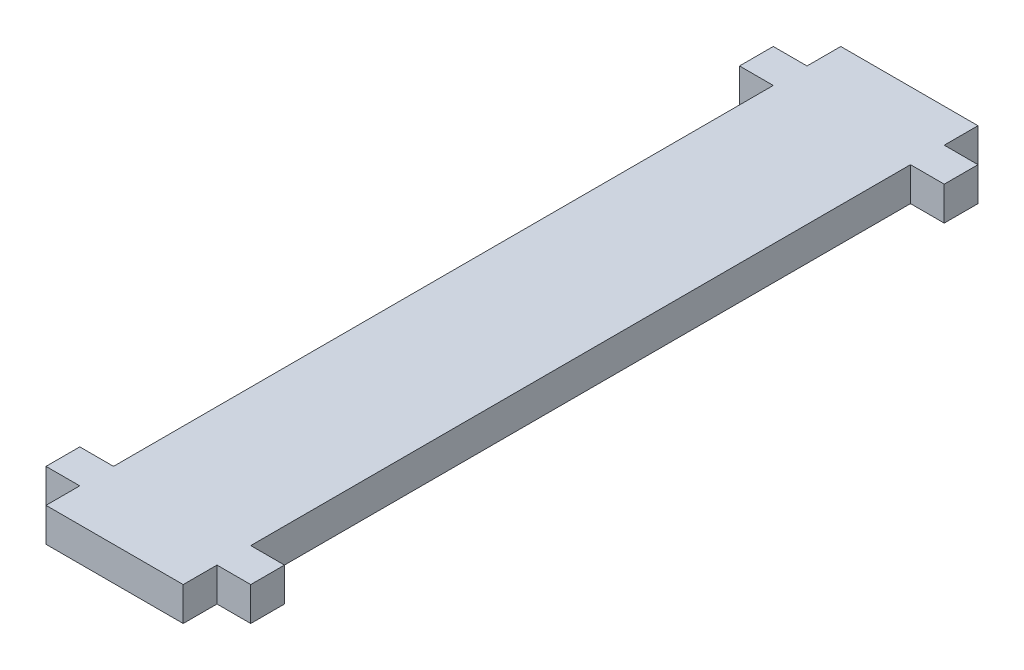
ISO-10303-21;
HEADER;
FILE_DESCRIPTION(('STEP AP214'),'2;1');
FILE_NAME('part.step','',(''),(''),'','','');
FILE_SCHEMA(('AUTOMOTIVE_DESIGN { 1 0 10303 214 1 1 1 1 }'));
ENDSEC;
DATA;
#1=APPLICATION_CONTEXT('core data for automotive mechanical design processes');
#2=APPLICATION_PROTOCOL_DEFINITION('international standard','automotive_design',2000,#1);
#3=PRODUCT_CONTEXT('',#1,'mechanical');
#4=PRODUCT('Part','Part','',(#3));
#5=PRODUCT_RELATED_PRODUCT_CATEGORY('part','',(#4));
#6=PRODUCT_DEFINITION_FORMATION('','',#4);
#7=PRODUCT_DEFINITION_CONTEXT('part definition',#1,'design');
#8=PRODUCT_DEFINITION('design','',#6,#7);
#9=PRODUCT_DEFINITION_SHAPE('','',#8);
#10=(LENGTH_UNIT() NAMED_UNIT(*) SI_UNIT(.MILLI.,.METRE.));
#11=(NAMED_UNIT(*) PLANE_ANGLE_UNIT() SI_UNIT($,.RADIAN.));
#12=(NAMED_UNIT(*) SI_UNIT($,.STERADIAN.) SOLID_ANGLE_UNIT());
#13=UNCERTAINTY_MEASURE_WITH_UNIT(LENGTH_MEASURE(1.E-05),#10,'distance_accuracy_value','');
#14=(GEOMETRIC_REPRESENTATION_CONTEXT(3) GLOBAL_UNCERTAINTY_ASSIGNED_CONTEXT((#13)) GLOBAL_UNIT_ASSIGNED_CONTEXT((#10,
#11,#12)) REPRESENTATION_CONTEXT('',''));
#15=CARTESIAN_POINT('',(0.,0.,0.));
#16=DIRECTION('',(0.,0.,1.));
#17=DIRECTION('',(1.,0.,0.));
#18=AXIS2_PLACEMENT_3D('',#15,#16,#17);
#19=CARTESIAN_POINT('',(-60.2742,3.1242,-128.8542));
#20=DIRECTION('',(1.,0.,0.));
#21=DIRECTION('',(0.,0.,-1.));
#22=AXIS2_PLACEMENT_3D('',#19,#20,#21);
#23=PLANE('',#22);
#24=DIRECTION('',(0.,0.,1.));
#25=VECTOR('',#24,1.);
#26=CARTESIAN_POINT('',(-60.2742,0.,-128.8542));
#27=LINE('',#26,#25);
#28=CARTESIAN_POINT('',(-60.2742,0.,-128.8542));
#29=VERTEX_POINT('',#28);
#30=CARTESIAN_POINT('',(-60.2742,0.,-125.73));
#31=VERTEX_POINT('',#30);
#32=EDGE_CURVE('E201',#29,#31,#27,.T.);
#33=ORIENTED_EDGE('',*,*,#32,.T.);
#34=DIRECTION('',(0.,-1.,0.));
#35=VECTOR('',#34,1.);
#36=CARTESIAN_POINT('',(-60.2742,3.1242,-125.73));
#37=LINE('',#36,#35);
#38=CARTESIAN_POINT('',(-60.2742,3.1242,-125.73));
#39=VERTEX_POINT('',#38);
#40=EDGE_CURVE('E11',#39,#31,#37,.T.);
#41=ORIENTED_EDGE('',*,*,#40,.F.);
#42=DIRECTION('',(0.,0.,1.));
#43=VECTOR('',#42,1.);
#44=CARTESIAN_POINT('',(-60.2742,3.1242,-128.8542));
#45=LINE('',#44,#43);
#46=CARTESIAN_POINT('',(-60.2742,3.1242,-128.8542));
#47=VERTEX_POINT('',#46);
#48=EDGE_CURVE('E239',#47,#39,#45,.T.);
#49=ORIENTED_EDGE('',*,*,#48,.F.);
#50=DIRECTION('',(0.,-1.,0.));
#51=VECTOR('',#50,1.);
#52=CARTESIAN_POINT('',(-60.2742,3.1242,-128.8542));
#53=LINE('',#52,#51);
#54=EDGE_CURVE('E197',#47,#29,#53,.T.);
#55=ORIENTED_EDGE('',*,*,#54,.T.);
#56=EDGE_LOOP('',(#33,#41,#49,#55));
#57=FACE_BOUND('',#56,.T.);
#58=ADVANCED_FACE('F33',(#57),#23,.F.);
#59=CARTESIAN_POINT('',(-60.2742,3.1242,-125.73));
#60=DIRECTION('',(0.,0.,-1.));
#61=DIRECTION('',(-1.,0.,0.));
#62=AXIS2_PLACEMENT_3D('',#59,#60,#61);
#63=PLANE('',#62);
#64=DIRECTION('',(1.,0.,0.));
#65=VECTOR('',#64,1.);
#66=CARTESIAN_POINT('',(-60.2742,0.,-125.73));
#67=LINE('',#66,#65);
#68=CARTESIAN_POINT('',(-57.15,0.,-125.73));
#69=VERTEX_POINT('',#68);
#70=EDGE_CURVE('E204',#31,#69,#67,.T.);
#71=ORIENTED_EDGE('',*,*,#70,.T.);
#72=DIRECTION('',(0.,-1.,0.));
#73=VECTOR('',#72,1.);
#74=CARTESIAN_POINT('',(-57.15,3.1242,-125.73));
#75=LINE('',#74,#73);
#76=CARTESIAN_POINT('',(-57.15,3.1242,-125.73));
#77=VERTEX_POINT('',#76);
#78=EDGE_CURVE('E41',#77,#69,#75,.T.);
#79=ORIENTED_EDGE('',*,*,#78,.F.);
#80=DIRECTION('',(1.,0.,0.));
#81=VECTOR('',#80,1.);
#82=CARTESIAN_POINT('',(-60.2742,3.1242,-125.73));
#83=LINE('',#82,#81);
#84=EDGE_CURVE('E128',#39,#77,#83,.T.);
#85=ORIENTED_EDGE('',*,*,#84,.F.);
#86=ORIENTED_EDGE('',*,*,#40,.T.);
#87=EDGE_LOOP('',(#71,#79,#85,#86));
#88=FACE_BOUND('',#87,.T.);
#89=ADVANCED_FACE('F357',(#88),#63,.F.);
#90=CARTESIAN_POINT('',(-57.15,3.1242,-125.73));
#91=DIRECTION('',(1.,0.,0.));
#92=DIRECTION('',(0.,0.,-1.));
#93=AXIS2_PLACEMENT_3D('',#90,#91,#92);
#94=PLANE('',#93);
#95=DIRECTION('',(0.,0.,1.));
#96=VECTOR('',#95,1.);
#97=CARTESIAN_POINT('',(-57.15,0.,-125.73));
#98=LINE('',#97,#96);
#99=CARTESIAN_POINT('',(-57.15,0.,-64.6684));
#100=VERTEX_POINT('',#99);
#101=EDGE_CURVE('E206',#69,#100,#98,.T.);
#102=ORIENTED_EDGE('',*,*,#101,.T.);
#103=DIRECTION('',(0.,-1.,0.));
#104=VECTOR('',#103,1.);
#105=CARTESIAN_POINT('',(-57.15,3.1242,-64.6684));
#106=LINE('',#105,#104);
#107=CARTESIAN_POINT('',(-57.15,3.1242,-64.6684));
#108=VERTEX_POINT('',#107);
#109=EDGE_CURVE('E282',#108,#100,#106,.T.);
#110=ORIENTED_EDGE('',*,*,#109,.F.);
#111=DIRECTION('',(0.,0.,1.));
#112=VECTOR('',#111,1.);
#113=CARTESIAN_POINT('',(-57.15,3.1242,-125.73));
#114=LINE('',#113,#112);
#115=EDGE_CURVE('E290',#77,#108,#114,.T.);
#116=ORIENTED_EDGE('',*,*,#115,.F.);
#117=ORIENTED_EDGE('',*,*,#78,.T.);
#118=EDGE_LOOP('',(#102,#110,#116,#117));
#119=FACE_BOUND('',#118,.T.);
#120=ADVANCED_FACE('F288',(#119),#94,.F.);
#121=CARTESIAN_POINT('',(-57.15,3.1242,-64.6684));
#122=DIRECTION('',(0.,0.,1.));
#123=DIRECTION('',(1.,0.,0.));
#124=AXIS2_PLACEMENT_3D('',#121,#122,#123);
#125=PLANE('',#124);
#126=DIRECTION('',(-1.,0.,0.));
#127=VECTOR('',#126,1.);
#128=CARTESIAN_POINT('',(-57.15,0.,-64.6684));
#129=LINE('',#128,#127);
#130=CARTESIAN_POINT('',(-60.2742,0.,-64.6684));
#131=VERTEX_POINT('',#130);
#132=EDGE_CURVE('E208',#100,#131,#129,.T.);
#133=ORIENTED_EDGE('',*,*,#132,.T.);
#134=DIRECTION('',(0.,-1.,0.));
#135=VECTOR('',#134,1.);
#136=CARTESIAN_POINT('',(-60.2742,3.1242,-64.6684));
#137=LINE('',#136,#135);
#138=CARTESIAN_POINT('',(-60.2742,3.1242,-64.6684));
#139=VERTEX_POINT('',#138);
#140=EDGE_CURVE('E279',#139,#131,#137,.T.);
#141=ORIENTED_EDGE('',*,*,#140,.F.);
#142=DIRECTION('',(-1.,0.,0.));
#143=VECTOR('',#142,1.);
#144=CARTESIAN_POINT('',(-57.15,3.1242,-64.6684));
#145=LINE('',#144,#143);
#146=EDGE_CURVE('E308',#108,#139,#145,.T.);
#147=ORIENTED_EDGE('',*,*,#146,.F.);
#148=ORIENTED_EDGE('',*,*,#109,.T.);
#149=EDGE_LOOP('',(#133,#141,#147,#148));
#150=FACE_BOUND('',#149,.T.);
#151=ADVANCED_FACE('F299',(#150),#125,.F.);
#152=CARTESIAN_POINT('',(-60.2742,3.1242,-64.6684));
#153=DIRECTION('',(1.,0.,0.));
#154=DIRECTION('',(0.,0.,-1.));
#155=AXIS2_PLACEMENT_3D('',#152,#153,#154);
#156=PLANE('',#155);
#157=DIRECTION('',(0.,0.,1.));
#158=VECTOR('',#157,1.);
#159=CARTESIAN_POINT('',(-60.2742,0.,-64.6684));
#160=LINE('',#159,#158);
#161=CARTESIAN_POINT('',(-60.2742,0.,-61.5442));
#162=VERTEX_POINT('',#161);
#163=EDGE_CURVE('E210',#131,#162,#160,.T.);
#164=ORIENTED_EDGE('',*,*,#163,.T.);
#165=DIRECTION('',(0.,-1.,0.));
#166=VECTOR('',#165,1.);
#167=CARTESIAN_POINT('',(-60.2742,3.1242,-61.5442));
#168=LINE('',#167,#166);
#169=CARTESIAN_POINT('',(-60.2742,3.1242,-61.5442));
#170=VERTEX_POINT('',#169);
#171=EDGE_CURVE('E276',#170,#162,#168,.T.);
#172=ORIENTED_EDGE('',*,*,#171,.F.);
#173=DIRECTION('',(0.,0.,1.));
#174=VECTOR('',#173,1.);
#175=CARTESIAN_POINT('',(-60.2742,3.1242,-64.6684));
#176=LINE('',#175,#174);
#177=EDGE_CURVE('E305',#139,#170,#176,.T.);
#178=ORIENTED_EDGE('',*,*,#177,.F.);
#179=ORIENTED_EDGE('',*,*,#140,.T.);
#180=EDGE_LOOP('',(#164,#172,#178,#179));
#181=FACE_BOUND('',#180,.T.);
#182=ADVANCED_FACE('F303',(#181),#156,.F.);
#183=CARTESIAN_POINT('',(-60.2742,3.1242,-61.5442));
#184=DIRECTION('',(0.,0.,-1.));
#185=DIRECTION('',(-1.,0.,0.));
#186=AXIS2_PLACEMENT_3D('',#183,#184,#185);
#187=PLANE('',#186);
#188=DIRECTION('',(1.,0.,0.));
#189=VECTOR('',#188,1.);
#190=CARTESIAN_POINT('',(-60.2742,0.,-61.5442));
#191=LINE('',#190,#189);
#192=CARTESIAN_POINT('',(-57.15,0.,-61.5442));
#193=VERTEX_POINT('',#192);
#194=EDGE_CURVE('E212',#162,#193,#191,.T.);
#195=ORIENTED_EDGE('',*,*,#194,.T.);
#196=DIRECTION('',(0.,-1.,0.));
#197=VECTOR('',#196,1.);
#198=CARTESIAN_POINT('',(-57.15,3.1242,-61.5442));
#199=LINE('',#198,#197);
#200=CARTESIAN_POINT('',(-57.15,3.1242,-61.5442));
#201=VERTEX_POINT('',#200);
#202=EDGE_CURVE('E273',#201,#193,#199,.T.);
#203=ORIENTED_EDGE('',*,*,#202,.F.);
#204=DIRECTION('',(1.,0.,0.));
#205=VECTOR('',#204,1.);
#206=CARTESIAN_POINT('',(-60.2742,3.1242,-61.5442));
#207=LINE('',#206,#205);
#208=EDGE_CURVE('E307',#170,#201,#207,.T.);
#209=ORIENTED_EDGE('',*,*,#208,.F.);
#210=ORIENTED_EDGE('',*,*,#171,.T.);
#211=EDGE_LOOP('',(#195,#203,#209,#210));
#212=FACE_BOUND('',#211,.T.);
#213=ADVANCED_FACE('F370',(#212),#187,.F.);
#214=CARTESIAN_POINT('',(-57.15,3.1242,-61.5442));
#215=DIRECTION('',(1.,0.,0.));
#216=DIRECTION('',(0.,0.,-1.));
#217=AXIS2_PLACEMENT_3D('',#214,#215,#216);
#218=PLANE('',#217);
#219=DIRECTION('',(0.,0.,1.));
#220=VECTOR('',#219,1.);
#221=CARTESIAN_POINT('',(-57.15,0.,-61.5442));
#222=LINE('',#221,#220);
#223=CARTESIAN_POINT('',(-57.15,0.,-58.42));
#224=VERTEX_POINT('',#223);
#225=EDGE_CURVE('E214',#193,#224,#222,.T.);
#226=ORIENTED_EDGE('',*,*,#225,.T.);
#227=DIRECTION('',(0.,-1.,0.));
#228=VECTOR('',#227,1.);
#229=CARTESIAN_POINT('',(-57.15,3.1242,-58.42));
#230=LINE('',#229,#228);
#231=CARTESIAN_POINT('',(-57.15,3.1242,-58.42));
#232=VERTEX_POINT('',#231);
#233=EDGE_CURVE('E270',#232,#224,#230,.T.);
#234=ORIENTED_EDGE('',*,*,#233,.F.);
#235=DIRECTION('',(0.,0.,1.));
#236=VECTOR('',#235,1.);
#237=CARTESIAN_POINT('',(-57.15,3.1242,-61.5442));
#238=LINE('',#237,#236);
#239=EDGE_CURVE('E310',#201,#232,#238,.T.);
#240=ORIENTED_EDGE('',*,*,#239,.F.);
#241=ORIENTED_EDGE('',*,*,#202,.T.);
#242=EDGE_LOOP('',(#226,#234,#240,#241));
#243=FACE_BOUND('',#242,.T.);
#244=ADVANCED_FACE('F373',(#243),#218,.F.);
#245=CARTESIAN_POINT('',(-57.15,3.1242,-58.42));
#246=DIRECTION('',(0.,0.,-1.));
#247=DIRECTION('',(-1.,0.,0.));
#248=AXIS2_PLACEMENT_3D('',#245,#246,#247);
#249=PLANE('',#248);
#250=DIRECTION('',(1.,0.,0.));
#251=VECTOR('',#250,1.);
#252=CARTESIAN_POINT('',(-57.15,0.,-58.42));
#253=LINE('',#252,#251);
#254=CARTESIAN_POINT('',(-44.45,0.,-58.42));
#255=VERTEX_POINT('',#254);
#256=EDGE_CURVE('E216',#224,#255,#253,.T.);
#257=ORIENTED_EDGE('',*,*,#256,.T.);
#258=DIRECTION('',(0.,-1.,0.));
#259=VECTOR('',#258,1.);
#260=CARTESIAN_POINT('',(-44.45,3.1242,-58.42));
#261=LINE('',#260,#259);
#262=CARTESIAN_POINT('',(-44.45,3.1242,-58.42));
#263=VERTEX_POINT('',#262);
#264=EDGE_CURVE('E267',#263,#255,#261,.T.);
#265=ORIENTED_EDGE('',*,*,#264,.F.);
#266=DIRECTION('',(1.,0.,0.));
#267=VECTOR('',#266,1.);
#268=CARTESIAN_POINT('',(-57.15,3.1242,-58.42));
#269=LINE('',#268,#267);
#270=EDGE_CURVE('E316',#232,#263,#269,.T.);
#271=ORIENTED_EDGE('',*,*,#270,.F.);
#272=ORIENTED_EDGE('',*,*,#233,.T.);
#273=EDGE_LOOP('',(#257,#265,#271,#272));
#274=FACE_BOUND('',#273,.T.);
#275=ADVANCED_FACE('F377',(#274),#249,.F.);
#276=CARTESIAN_POINT('',(-44.45,3.1242,-58.42));
#277=DIRECTION('',(-1.,0.,0.));
#278=DIRECTION('',(0.,0.,1.));
#279=AXIS2_PLACEMENT_3D('',#276,#277,#278);
#280=PLANE('',#279);
#281=DIRECTION('',(0.,0.,-1.));
#282=VECTOR('',#281,1.);
#283=CARTESIAN_POINT('',(-44.45,0.,-58.42));
#284=LINE('',#283,#282);
#285=CARTESIAN_POINT('',(-44.45,0.,-61.5442));
#286=VERTEX_POINT('',#285);
#287=EDGE_CURVE('E218',#255,#286,#284,.T.);
#288=ORIENTED_EDGE('',*,*,#287,.T.);
#289=DIRECTION('',(0.,-1.,0.));
#290=VECTOR('',#289,1.);
#291=CARTESIAN_POINT('',(-44.45,3.1242,-61.5442));
#292=LINE('',#291,#290);
#293=CARTESIAN_POINT('',(-44.45,3.1242,-61.5442));
#294=VERTEX_POINT('',#293);
#295=EDGE_CURVE('E264',#294,#286,#292,.T.);
#296=ORIENTED_EDGE('',*,*,#295,.F.);
#297=DIRECTION('',(0.,0.,-1.));
#298=VECTOR('',#297,1.);
#299=CARTESIAN_POINT('',(-44.45,3.1242,-58.42));
#300=LINE('',#299,#298);
#301=EDGE_CURVE('E318',#263,#294,#300,.T.);
#302=ORIENTED_EDGE('',*,*,#301,.F.);
#303=ORIENTED_EDGE('',*,*,#264,.T.);
#304=EDGE_LOOP('',(#288,#296,#302,#303));
#305=FACE_BOUND('',#304,.T.);
#306=ADVANCED_FACE('F381',(#305),#280,.F.);
#307=CARTESIAN_POINT('',(-44.45,3.1242,-61.5442));
#308=DIRECTION('',(0.,0.,-1.));
#309=DIRECTION('',(-1.,0.,0.));
#310=AXIS2_PLACEMENT_3D('',#307,#308,#309);
#311=PLANE('',#310);
#312=DIRECTION('',(1.,0.,0.));
#313=VECTOR('',#312,1.);
#314=CARTESIAN_POINT('',(-44.45,0.,-61.5442));
#315=LINE('',#314,#313);
#316=CARTESIAN_POINT('',(-41.3258,0.,-61.5442));
#317=VERTEX_POINT('',#316);
#318=EDGE_CURVE('E220',#286,#317,#315,.T.);
#319=ORIENTED_EDGE('',*,*,#318,.T.);
#320=DIRECTION('',(0.,-1.,0.));
#321=VECTOR('',#320,1.);
#322=CARTESIAN_POINT('',(-41.3258,3.1242,-61.5442));
#323=LINE('',#322,#321);
#324=CARTESIAN_POINT('',(-41.3258,3.1242,-61.5442));
#325=VERTEX_POINT('',#324);
#326=EDGE_CURVE('E261',#325,#317,#323,.T.);
#327=ORIENTED_EDGE('',*,*,#326,.F.);
#328=DIRECTION('',(1.,0.,0.));
#329=VECTOR('',#328,1.);
#330=CARTESIAN_POINT('',(-44.45,3.1242,-61.5442));
#331=LINE('',#330,#329);
#332=EDGE_CURVE('E320',#294,#325,#331,.T.);
#333=ORIENTED_EDGE('',*,*,#332,.F.);
#334=ORIENTED_EDGE('',*,*,#295,.T.);
#335=EDGE_LOOP('',(#319,#327,#333,#334));
#336=FACE_BOUND('',#335,.T.);
#337=ADVANCED_FACE('F385',(#336),#311,.F.);
#338=CARTESIAN_POINT('',(-41.3258,3.1242,-61.5442));
#339=DIRECTION('',(-1.,0.,0.));
#340=DIRECTION('',(0.,0.,1.));
#341=AXIS2_PLACEMENT_3D('',#338,#339,#340);
#342=PLANE('',#341);
#343=DIRECTION('',(0.,0.,-1.));
#344=VECTOR('',#343,1.);
#345=CARTESIAN_POINT('',(-41.3258,0.,-61.5442));
#346=LINE('',#345,#344);
#347=CARTESIAN_POINT('',(-41.3258,0.,-64.6684));
#348=VERTEX_POINT('',#347);
#349=EDGE_CURVE('E222',#317,#348,#346,.T.);
#350=ORIENTED_EDGE('',*,*,#349,.T.);
#351=DIRECTION('',(0.,-1.,0.));
#352=VECTOR('',#351,1.);
#353=CARTESIAN_POINT('',(-41.3258,3.1242,-64.6684));
#354=LINE('',#353,#352);
#355=CARTESIAN_POINT('',(-41.3258,3.1242,-64.6684));
#356=VERTEX_POINT('',#355);
#357=EDGE_CURVE('E258',#356,#348,#354,.T.);
#358=ORIENTED_EDGE('',*,*,#357,.F.);
#359=DIRECTION('',(0.,0.,-1.));
#360=VECTOR('',#359,1.);
#361=CARTESIAN_POINT('',(-41.3258,3.1242,-61.5442));
#362=LINE('',#361,#360);
#363=EDGE_CURVE('E322',#325,#356,#362,.T.);
#364=ORIENTED_EDGE('',*,*,#363,.F.);
#365=ORIENTED_EDGE('',*,*,#326,.T.);
#366=EDGE_LOOP('',(#350,#358,#364,#365));
#367=FACE_BOUND('',#366,.T.);
#368=ADVANCED_FACE('F389',(#367),#342,.F.);
#369=CARTESIAN_POINT('',(-41.3258,3.1242,-64.6684));
#370=DIRECTION('',(0.,0.,1.));
#371=DIRECTION('',(1.,0.,0.));
#372=AXIS2_PLACEMENT_3D('',#369,#370,#371);
#373=PLANE('',#372);
#374=DIRECTION('',(-1.,0.,0.));
#375=VECTOR('',#374,1.);
#376=CARTESIAN_POINT('',(-41.3258,0.,-64.6684));
#377=LINE('',#376,#375);
#378=CARTESIAN_POINT('',(-44.45,0.,-64.6684));
#379=VERTEX_POINT('',#378);
#380=EDGE_CURVE('E224',#348,#379,#377,.T.);
#381=ORIENTED_EDGE('',*,*,#380,.T.);
#382=DIRECTION('',(0.,-1.,0.));
#383=VECTOR('',#382,1.);
#384=CARTESIAN_POINT('',(-44.45,3.1242,-64.6684));
#385=LINE('',#384,#383);
#386=CARTESIAN_POINT('',(-44.45,3.1242,-64.6684));
#387=VERTEX_POINT('',#386);
#388=EDGE_CURVE('E255',#387,#379,#385,.T.);
#389=ORIENTED_EDGE('',*,*,#388,.F.);
#390=DIRECTION('',(-1.,0.,0.));
#391=VECTOR('',#390,1.);
#392=CARTESIAN_POINT('',(-41.3258,3.1242,-64.6684));
#393=LINE('',#392,#391);
#394=EDGE_CURVE('E324',#356,#387,#393,.T.);
#395=ORIENTED_EDGE('',*,*,#394,.F.);
#396=ORIENTED_EDGE('',*,*,#357,.T.);
#397=EDGE_LOOP('',(#381,#389,#395,#396));
#398=FACE_BOUND('',#397,.T.);
#399=ADVANCED_FACE('F393',(#398),#373,.F.);
#400=CARTESIAN_POINT('',(-44.45,3.1242,-64.6684));
#401=DIRECTION('',(-1.,0.,0.));
#402=DIRECTION('',(0.,0.,1.));
#403=AXIS2_PLACEMENT_3D('',#400,#401,#402);
#404=PLANE('',#403);
#405=DIRECTION('',(0.,0.,-1.));
#406=VECTOR('',#405,1.);
#407=CARTESIAN_POINT('',(-44.45,0.,-64.6684));
#408=LINE('',#407,#406);
#409=CARTESIAN_POINT('',(-44.4500000000001,0.,-125.73));
#410=VERTEX_POINT('',#409);
#411=EDGE_CURVE('E226',#379,#410,#408,.T.);
#412=ORIENTED_EDGE('',*,*,#411,.T.);
#413=DIRECTION('',(0.,-1.,0.));
#414=VECTOR('',#413,1.);
#415=CARTESIAN_POINT('',(-44.4500000000001,3.1242,-125.73));
#416=LINE('',#415,#414);
#417=CARTESIAN_POINT('',(-44.4500000000001,3.1242,-125.73));
#418=VERTEX_POINT('',#417);
#419=EDGE_CURVE('E252',#418,#410,#416,.T.);
#420=ORIENTED_EDGE('',*,*,#419,.F.);
#421=DIRECTION('',(0.,0.,-1.));
#422=VECTOR('',#421,1.);
#423=CARTESIAN_POINT('',(-44.45,3.1242,-64.6684));
#424=LINE('',#423,#422);
#425=EDGE_CURVE('E326',#387,#418,#424,.T.);
#426=ORIENTED_EDGE('',*,*,#425,.F.);
#427=ORIENTED_EDGE('',*,*,#388,.T.);
#428=EDGE_LOOP('',(#412,#420,#426,#427));
#429=FACE_BOUND('',#428,.T.);
#430=ADVANCED_FACE('F397',(#429),#404,.F.);
#431=CARTESIAN_POINT('',(-44.4500000000001,3.1242,-125.73));
#432=DIRECTION('',(0.,0.,-1.));
#433=DIRECTION('',(-1.,0.,0.));
#434=AXIS2_PLACEMENT_3D('',#431,#432,#433);
#435=PLANE('',#434);
#436=DIRECTION('',(1.,0.,0.));
#437=VECTOR('',#436,1.);
#438=CARTESIAN_POINT('',(-44.4500000000001,0.,-125.73));
#439=LINE('',#438,#437);
#440=CARTESIAN_POINT('',(-41.3258,0.,-125.73));
#441=VERTEX_POINT('',#440);
#442=EDGE_CURVE('E228',#410,#441,#439,.T.);
#443=ORIENTED_EDGE('',*,*,#442,.T.);
#444=DIRECTION('',(0.,-1.,0.));
#445=VECTOR('',#444,1.);
#446=CARTESIAN_POINT('',(-41.3258,3.1242,-125.73));
#447=LINE('',#446,#445);
#448=CARTESIAN_POINT('',(-41.3258,3.1242,-125.73));
#449=VERTEX_POINT('',#448);
#450=EDGE_CURVE('E249',#449,#441,#447,.T.);
#451=ORIENTED_EDGE('',*,*,#450,.F.);
#452=DIRECTION('',(1.,0.,0.));
#453=VECTOR('',#452,1.);
#454=CARTESIAN_POINT('',(-44.4500000000001,3.1242,-125.73));
#455=LINE('',#454,#453);
#456=EDGE_CURVE('E328',#418,#449,#455,.T.);
#457=ORIENTED_EDGE('',*,*,#456,.F.);
#458=ORIENTED_EDGE('',*,*,#419,.T.);
#459=EDGE_LOOP('',(#443,#451,#457,#458));
#460=FACE_BOUND('',#459,.T.);
#461=ADVANCED_FACE('F401',(#460),#435,.F.);
#462=CARTESIAN_POINT('',(-41.3258,3.1242,-125.73));
#463=DIRECTION('',(-1.,0.,0.));
#464=DIRECTION('',(0.,0.,1.));
#465=AXIS2_PLACEMENT_3D('',#462,#463,#464);
#466=PLANE('',#465);
#467=DIRECTION('',(0.,0.,-1.));
#468=VECTOR('',#467,1.);
#469=CARTESIAN_POINT('',(-41.3258,0.,-125.73));
#470=LINE('',#469,#468);
#471=CARTESIAN_POINT('',(-41.3258,0.,-128.8542));
#472=VERTEX_POINT('',#471);
#473=EDGE_CURVE('E230',#441,#472,#470,.T.);
#474=ORIENTED_EDGE('',*,*,#473,.T.);
#475=DIRECTION('',(0.,-1.,0.));
#476=VECTOR('',#475,1.);
#477=CARTESIAN_POINT('',(-41.3258,3.1242,-128.8542));
#478=LINE('',#477,#476);
#479=CARTESIAN_POINT('',(-41.3258,3.1242,-128.8542));
#480=VERTEX_POINT('',#479);
#481=EDGE_CURVE('E246',#480,#472,#478,.T.);
#482=ORIENTED_EDGE('',*,*,#481,.F.);
#483=DIRECTION('',(0.,0.,-1.));
#484=VECTOR('',#483,1.);
#485=CARTESIAN_POINT('',(-41.3258,3.1242,-125.73));
#486=LINE('',#485,#484);
#487=EDGE_CURVE('E330',#449,#480,#486,.T.);
#488=ORIENTED_EDGE('',*,*,#487,.F.);
#489=ORIENTED_EDGE('',*,*,#450,.T.);
#490=EDGE_LOOP('',(#474,#482,#488,#489));
#491=FACE_BOUND('',#490,.T.);
#492=ADVANCED_FACE('F405',(#491),#466,.F.);
#493=CARTESIAN_POINT('',(-41.3258,3.1242,-128.8542));
#494=DIRECTION('',(0.,0.,1.));
#495=DIRECTION('',(1.,0.,0.));
#496=AXIS2_PLACEMENT_3D('',#493,#494,#495);
#497=PLANE('',#496);
#498=DIRECTION('',(-1.,0.,0.));
#499=VECTOR('',#498,1.);
#500=CARTESIAN_POINT('',(-41.3258,0.,-128.8542));
#501=LINE('',#500,#499);
#502=CARTESIAN_POINT('',(-44.45,0.,-128.8542));
#503=VERTEX_POINT('',#502);
#504=EDGE_CURVE('E232',#472,#503,#501,.T.);
#505=ORIENTED_EDGE('',*,*,#504,.T.);
#506=DIRECTION('',(0.,-1.,0.));
#507=VECTOR('',#506,1.);
#508=CARTESIAN_POINT('',(-44.45,3.1242,-128.8542));
#509=LINE('',#508,#507);
#510=CARTESIAN_POINT('',(-44.45,3.1242,-128.8542));
#511=VERTEX_POINT('',#510);
#512=EDGE_CURVE('E243',#511,#503,#509,.T.);
#513=ORIENTED_EDGE('',*,*,#512,.F.);
#514=DIRECTION('',(-1.,0.,0.));
#515=VECTOR('',#514,1.);
#516=CARTESIAN_POINT('',(-41.3258,3.1242,-128.8542));
#517=LINE('',#516,#515);
#518=EDGE_CURVE('E332',#480,#511,#517,.T.);
#519=ORIENTED_EDGE('',*,*,#518,.F.);
#520=ORIENTED_EDGE('',*,*,#481,.T.);
#521=EDGE_LOOP('',(#505,#513,#519,#520));
#522=FACE_BOUND('',#521,.T.);
#523=ADVANCED_FACE('F338',(#522),#497,.F.);
#524=CARTESIAN_POINT('',(-44.45,3.1242,-128.8542));
#525=DIRECTION('',(-1.,0.,0.));
#526=DIRECTION('',(0.,0.,1.));
#527=AXIS2_PLACEMENT_3D('',#524,#525,#526);
#528=PLANE('',#527);
#529=DIRECTION('',(0.,0.,-1.));
#530=VECTOR('',#529,1.);
#531=CARTESIAN_POINT('',(-44.45,0.,-128.8542));
#532=LINE('',#531,#530);
#533=CARTESIAN_POINT('',(-44.45,0.,-131.9784));
#534=VERTEX_POINT('',#533);
#535=EDGE_CURVE('E234',#503,#534,#532,.T.);
#536=ORIENTED_EDGE('',*,*,#535,.T.);
#537=DIRECTION('',(0.,-1.,0.));
#538=VECTOR('',#537,1.);
#539=CARTESIAN_POINT('',(-44.45,3.1242,-131.9784));
#540=LINE('',#539,#538);
#541=CARTESIAN_POINT('',(-44.45,3.1242,-131.9784));
#542=VERTEX_POINT('',#541);
#543=EDGE_CURVE('E192',#542,#534,#540,.T.);
#544=ORIENTED_EDGE('',*,*,#543,.F.);
#545=DIRECTION('',(0.,0.,-1.));
#546=VECTOR('',#545,1.);
#547=CARTESIAN_POINT('',(-44.45,3.1242,-128.8542));
#548=LINE('',#547,#546);
#549=EDGE_CURVE('E183',#511,#542,#548,.T.);
#550=ORIENTED_EDGE('',*,*,#549,.F.);
#551=ORIENTED_EDGE('',*,*,#512,.T.);
#552=EDGE_LOOP('',(#536,#544,#550,#551));
#553=FACE_BOUND('',#552,.T.);
#554=ADVANCED_FACE('F342',(#553),#528,.F.);
#555=CARTESIAN_POINT('',(-44.45,3.1242,-131.9784));
#556=DIRECTION('',(0.,0.,1.));
#557=DIRECTION('',(1.,0.,0.));
#558=AXIS2_PLACEMENT_3D('',#555,#556,#557);
#559=PLANE('',#558);
#560=DIRECTION('',(-1.,0.,0.));
#561=VECTOR('',#560,1.);
#562=CARTESIAN_POINT('',(-44.45,0.,-131.9784));
#563=LINE('',#562,#561);
#564=CARTESIAN_POINT('',(-57.15,0.,-131.9784));
#565=VERTEX_POINT('',#564);
#566=EDGE_CURVE('E191',#534,#565,#563,.T.);
#567=ORIENTED_EDGE('',*,*,#566,.T.);
#568=DIRECTION('',(0.,-1.,0.));
#569=VECTOR('',#568,1.);
#570=CARTESIAN_POINT('',(-57.15,3.1242,-131.9784));
#571=LINE('',#570,#569);
#572=CARTESIAN_POINT('',(-57.15,3.1242,-131.9784));
#573=VERTEX_POINT('',#572);
#574=EDGE_CURVE('E188',#573,#565,#571,.T.);
#575=ORIENTED_EDGE('',*,*,#574,.F.);
#576=DIRECTION('',(-1.,0.,0.));
#577=VECTOR('',#576,1.);
#578=CARTESIAN_POINT('',(-44.45,3.1242,-131.9784));
#579=LINE('',#578,#577);
#580=EDGE_CURVE('E177',#542,#573,#579,.T.);
#581=ORIENTED_EDGE('',*,*,#580,.F.);
#582=ORIENTED_EDGE('',*,*,#543,.T.);
#583=EDGE_LOOP('',(#567,#575,#581,#582));
#584=FACE_BOUND('',#583,.T.);
#585=ADVANCED_FACE('F189',(#584),#559,.F.);
#586=CARTESIAN_POINT('',(-57.15,3.1242,-131.9784));
#587=DIRECTION('',(1.,0.,0.));
#588=DIRECTION('',(0.,0.,-1.));
#589=AXIS2_PLACEMENT_3D('',#586,#587,#588);
#590=PLANE('',#589);
#591=DIRECTION('',(0.,0.,1.));
#592=VECTOR('',#591,1.);
#593=CARTESIAN_POINT('',(-57.15,0.,-131.9784));
#594=LINE('',#593,#592);
#595=CARTESIAN_POINT('',(-57.15,0.,-128.8542));
#596=VERTEX_POINT('',#595);
#597=EDGE_CURVE('E114',#565,#596,#594,.T.);
#598=ORIENTED_EDGE('',*,*,#597,.T.);
#599=DIRECTION('',(0.,-1.,0.));
#600=VECTOR('',#599,1.);
#601=CARTESIAN_POINT('',(-57.15,3.1242,-128.8542));
#602=LINE('',#601,#600);
#603=CARTESIAN_POINT('',(-57.15,3.1242,-128.8542));
#604=VERTEX_POINT('',#603);
#605=EDGE_CURVE('E193',#604,#596,#602,.T.);
#606=ORIENTED_EDGE('',*,*,#605,.F.);
#607=DIRECTION('',(0.,0.,1.));
#608=VECTOR('',#607,1.);
#609=CARTESIAN_POINT('',(-57.15,3.1242,-131.9784));
#610=LINE('',#609,#608);
#611=EDGE_CURVE('E181',#573,#604,#610,.T.);
#612=ORIENTED_EDGE('',*,*,#611,.F.);
#613=ORIENTED_EDGE('',*,*,#574,.T.);
#614=EDGE_LOOP('',(#598,#606,#612,#613));
#615=FACE_BOUND('',#614,.T.);
#616=ADVANCED_FACE('F195',(#615),#590,.F.);
#617=CARTESIAN_POINT('',(-57.15,3.1242,-128.8542));
#618=DIRECTION('',(0.,0.,1.));
#619=DIRECTION('',(1.,0.,0.));
#620=AXIS2_PLACEMENT_3D('',#617,#618,#619);
#621=PLANE('',#620);
#622=DIRECTION('',(-1.,0.,0.));
#623=VECTOR('',#622,1.);
#624=CARTESIAN_POINT('',(-57.15,0.,-128.8542));
#625=LINE('',#624,#623);
#626=EDGE_CURVE('E120',#596,#29,#625,.T.);
#627=ORIENTED_EDGE('',*,*,#626,.T.);
#628=ORIENTED_EDGE('',*,*,#54,.F.);
#629=DIRECTION('',(-1.,0.,0.));
#630=VECTOR('',#629,1.);
#631=CARTESIAN_POINT('',(-57.15,3.1242,-128.8542));
#632=LINE('',#631,#630);
#633=EDGE_CURVE('E49',#604,#47,#632,.T.);
#634=ORIENTED_EDGE('',*,*,#633,.F.);
#635=ORIENTED_EDGE('',*,*,#605,.T.);
#636=EDGE_LOOP('',(#627,#628,#634,#635));
#637=FACE_BOUND('',#636,.T.);
#638=ADVANCED_FACE('F346',(#637),#621,.F.);
#639=CARTESIAN_POINT('',(0.,3.1242,0.));
#640=DIRECTION('',(0.,1.,0.));
#641=DIRECTION('',(0.,0.,1.));
#642=AXIS2_PLACEMENT_3D('',#639,#640,#641);
#643=PLANE('',#642);
#644=ORIENTED_EDGE('',*,*,#48,.T.);
#645=ORIENTED_EDGE('',*,*,#84,.T.);
#646=ORIENTED_EDGE('',*,*,#115,.T.);
#647=ORIENTED_EDGE('',*,*,#146,.T.);
#648=ORIENTED_EDGE('',*,*,#177,.T.);
#649=ORIENTED_EDGE('',*,*,#208,.T.);
#650=ORIENTED_EDGE('',*,*,#239,.T.);
#651=ORIENTED_EDGE('',*,*,#270,.T.);
#652=ORIENTED_EDGE('',*,*,#301,.T.);
#653=ORIENTED_EDGE('',*,*,#332,.T.);
#654=ORIENTED_EDGE('',*,*,#363,.T.);
#655=ORIENTED_EDGE('',*,*,#394,.T.);
#656=ORIENTED_EDGE('',*,*,#425,.T.);
#657=ORIENTED_EDGE('',*,*,#456,.T.);
#658=ORIENTED_EDGE('',*,*,#487,.T.);
#659=ORIENTED_EDGE('',*,*,#518,.T.);
#660=ORIENTED_EDGE('',*,*,#549,.T.);
#661=ORIENTED_EDGE('',*,*,#580,.T.);
#662=ORIENTED_EDGE('',*,*,#611,.T.);
#663=ORIENTED_EDGE('',*,*,#633,.T.);
#664=EDGE_LOOP('',(#644,#645,#646,#647,#648,#649,#650,#651,#652,#653,#654,#655,#656,#657,#658,
#659,#660,#661,#662,#663));
#665=FACE_BOUND('',#664,.T.);
#666=ADVANCED_FACE('F179',(#665),#643,.T.);
#667=CARTESIAN_POINT('',(0.,0.,0.));
#668=DIRECTION('',(0.,1.,0.));
#669=DIRECTION('',(0.,0.,1.));
#670=AXIS2_PLACEMENT_3D('',#667,#668,#669);
#671=PLANE('',#670);
#672=ORIENTED_EDGE('',*,*,#32,.F.);
#673=ORIENTED_EDGE('',*,*,#626,.F.);
#674=ORIENTED_EDGE('',*,*,#597,.F.);
#675=ORIENTED_EDGE('',*,*,#566,.F.);
#676=ORIENTED_EDGE('',*,*,#535,.F.);
#677=ORIENTED_EDGE('',*,*,#504,.F.);
#678=ORIENTED_EDGE('',*,*,#473,.F.);
#679=ORIENTED_EDGE('',*,*,#442,.F.);
#680=ORIENTED_EDGE('',*,*,#411,.F.);
#681=ORIENTED_EDGE('',*,*,#380,.F.);
#682=ORIENTED_EDGE('',*,*,#349,.F.);
#683=ORIENTED_EDGE('',*,*,#318,.F.);
#684=ORIENTED_EDGE('',*,*,#287,.F.);
#685=ORIENTED_EDGE('',*,*,#256,.F.);
#686=ORIENTED_EDGE('',*,*,#225,.F.);
#687=ORIENTED_EDGE('',*,*,#194,.F.);
#688=ORIENTED_EDGE('',*,*,#163,.F.);
#689=ORIENTED_EDGE('',*,*,#132,.F.);
#690=ORIENTED_EDGE('',*,*,#101,.F.);
#691=ORIENTED_EDGE('',*,*,#70,.F.);
#692=EDGE_LOOP('',(#672,#673,#674,#675,#676,#677,#678,#679,#680,#681,#682,#683,#684,#685,#686,
#687,#688,#689,#690,#691));
#693=FACE_BOUND('',#692,.T.);
#694=ADVANCED_FACE('F294',(#693),#671,.F.);
#695=CLOSED_SHELL('',(#58,#89,#120,#151,#182,#213,#244,#275,#306,#337,#368,#399,#430,#461,#492,
#523,#554,#585,#616,#638,#666,#694));
#696=MANIFOLD_SOLID_BREP('B2',#695);
#697=ADVANCED_BREP_SHAPE_REPRESENTATION('',(#18,#696),#14);
#698=SHAPE_DEFINITION_REPRESENTATION(#9,#697);
ENDSEC;
END-ISO-10303-21;
